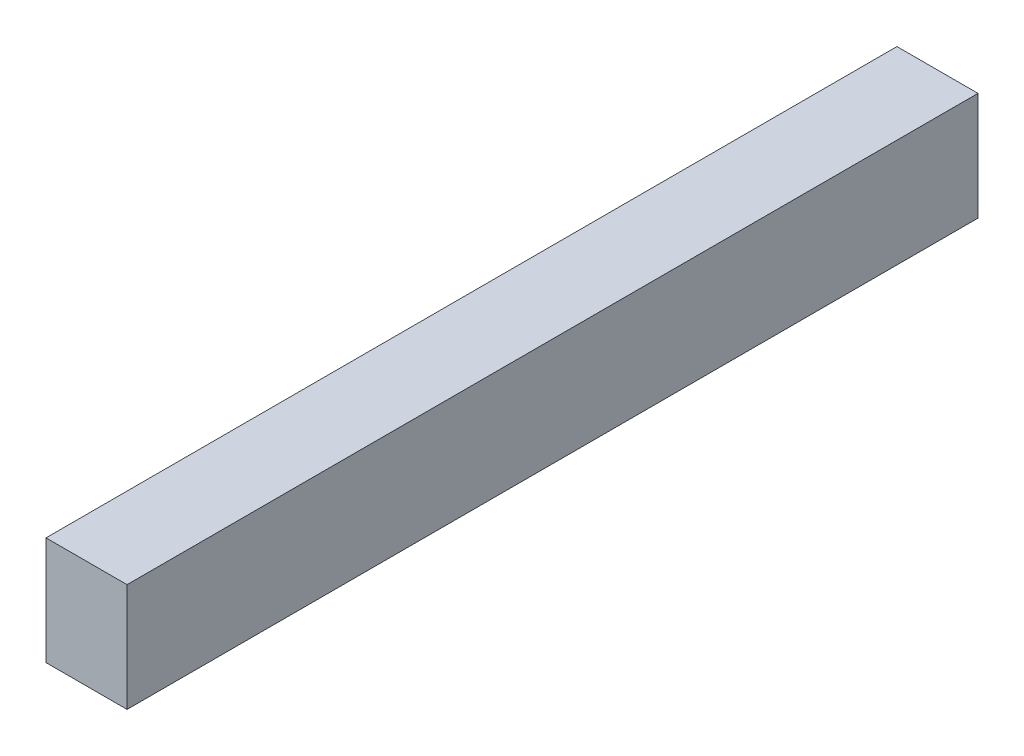
ISO-10303-21;
HEADER;
FILE_DESCRIPTION(('STEP AP214'),'2;1');
FILE_NAME('part.step','',(''),(''),'','','');
FILE_SCHEMA(('AUTOMOTIVE_DESIGN { 1 0 10303 214 1 1 1 1 }'));
ENDSEC;
DATA;
#1=APPLICATION_CONTEXT('core data for automotive mechanical design processes');
#2=APPLICATION_PROTOCOL_DEFINITION('international standard','automotive_design',2000,#1);
#3=PRODUCT_CONTEXT('',#1,'mechanical');
#4=PRODUCT('Part','Part','',(#3));
#5=PRODUCT_RELATED_PRODUCT_CATEGORY('part','',(#4));
#6=PRODUCT_DEFINITION_FORMATION('','',#4);
#7=PRODUCT_DEFINITION_CONTEXT('part definition',#1,'design');
#8=PRODUCT_DEFINITION('design','',#6,#7);
#9=PRODUCT_DEFINITION_SHAPE('','',#8);
#10=(LENGTH_UNIT() NAMED_UNIT(*) SI_UNIT(.MILLI.,.METRE.));
#11=(NAMED_UNIT(*) PLANE_ANGLE_UNIT() SI_UNIT($,.RADIAN.));
#12=(NAMED_UNIT(*) SI_UNIT($,.STERADIAN.) SOLID_ANGLE_UNIT());
#13=UNCERTAINTY_MEASURE_WITH_UNIT(LENGTH_MEASURE(1.E-05),#10,'distance_accuracy_value','');
#14=(GEOMETRIC_REPRESENTATION_CONTEXT(3) GLOBAL_UNCERTAINTY_ASSIGNED_CONTEXT((#13)) GLOBAL_UNIT_ASSIGNED_CONTEXT((#10,
#11,#12)) REPRESENTATION_CONTEXT('',''));
#15=CARTESIAN_POINT('',(0.,0.,0.));
#16=DIRECTION('',(0.,0.,1.));
#17=DIRECTION('',(1.,0.,0.));
#18=AXIS2_PLACEMENT_3D('',#15,#16,#17);
#19=CARTESIAN_POINT('',(-13.4796524663677,10.8968609865471,50.));
#20=DIRECTION('',(-1.,0.,0.));
#21=DIRECTION('',(0.,-1.,0.));
#22=AXIS2_PLACEMENT_3D('',#19,#20,#21);
#23=PLANE('',#22);
#24=DIRECTION('',(0.,1.,0.));
#25=VECTOR('',#24,1.);
#26=CARTESIAN_POINT('',(-13.4796524663677,10.8968609865471,0.));
#27=LINE('',#26,#25);
#28=CARTESIAN_POINT('',(-13.4796524663677,4.54686098654709,0.));
#29=VERTEX_POINT('',#28);
#30=CARTESIAN_POINT('',(-13.4796524663677,10.8968609865471,0.));
#31=VERTEX_POINT('',#30);
#32=EDGE_CURVE('E95',#29,#31,#27,.T.);
#33=ORIENTED_EDGE('',*,*,#32,.T.);
#34=DIRECTION('',(0.,0.,-1.));
#35=VECTOR('',#34,1.);
#36=CARTESIAN_POINT('',(-13.4796524663677,10.8968609865471,50.));
#37=LINE('',#36,#35);
#38=CARTESIAN_POINT('',(-13.4796524663677,10.8968609865471,50.));
#39=VERTEX_POINT('',#38);
#40=EDGE_CURVE('E11',#39,#31,#37,.T.);
#41=ORIENTED_EDGE('',*,*,#40,.F.);
#42=DIRECTION('',(0.,1.,0.));
#43=VECTOR('',#42,1.);
#44=CARTESIAN_POINT('',(-13.4796524663677,10.8968609865471,50.));
#45=LINE('',#44,#43);
#46=CARTESIAN_POINT('',(-13.4796524663677,4.54686098654709,50.));
#47=VERTEX_POINT('',#46);
#48=EDGE_CURVE('E83',#47,#39,#45,.T.);
#49=ORIENTED_EDGE('',*,*,#48,.F.);
#50=DIRECTION('',(0.,0.,-1.));
#51=VECTOR('',#50,1.);
#52=CARTESIAN_POINT('',(-13.4796524663677,4.54686098654709,50.));
#53=LINE('',#52,#51);
#54=EDGE_CURVE('E91',#47,#29,#53,.T.);
#55=ORIENTED_EDGE('',*,*,#54,.T.);
#56=EDGE_LOOP('',(#33,#41,#49,#55));
#57=FACE_BOUND('',#56,.T.);
#58=ADVANCED_FACE('F32',(#57),#23,.F.);
#59=CARTESIAN_POINT('',(-13.4796524663677,10.8968609865471,50.));
#60=DIRECTION('',(0.,-1.,0.));
#61=DIRECTION('',(1.,0.,0.));
#62=AXIS2_PLACEMENT_3D('',#59,#60,#61);
#63=PLANE('',#62);
#64=DIRECTION('',(-1.,0.,0.));
#65=VECTOR('',#64,1.);
#66=CARTESIAN_POINT('',(-13.4796524663677,10.8968609865471,0.));
#67=LINE('',#66,#65);
#68=CARTESIAN_POINT('',(-18.2421524663677,10.8968609865471,0.));
#69=VERTEX_POINT('',#68);
#70=EDGE_CURVE('E87',#31,#69,#67,.T.);
#71=ORIENTED_EDGE('',*,*,#70,.T.);
#72=DIRECTION('',(0.,0.,-1.));
#73=VECTOR('',#72,1.);
#74=CARTESIAN_POINT('',(-18.2421524663677,10.8968609865471,50.));
#75=LINE('',#74,#73);
#76=CARTESIAN_POINT('',(-18.2421524663677,10.8968609865471,50.));
#77=VERTEX_POINT('',#76);
#78=EDGE_CURVE('E40',#77,#69,#75,.T.);
#79=ORIENTED_EDGE('',*,*,#78,.F.);
#80=DIRECTION('',(-1.,0.,0.));
#81=VECTOR('',#80,1.);
#82=CARTESIAN_POINT('',(-13.4796524663677,10.8968609865471,50.));
#83=LINE('',#82,#81);
#84=EDGE_CURVE('E78',#39,#77,#83,.T.);
#85=ORIENTED_EDGE('',*,*,#84,.F.);
#86=ORIENTED_EDGE('',*,*,#40,.T.);
#87=EDGE_LOOP('',(#71,#79,#85,#86));
#88=FACE_BOUND('',#87,.T.);
#89=ADVANCED_FACE('F86',(#88),#63,.F.);
#90=CARTESIAN_POINT('',(-18.2421524663677,10.8968609865471,50.));
#91=DIRECTION('',(1.,0.,0.));
#92=DIRECTION('',(0.,1.,0.));
#93=AXIS2_PLACEMENT_3D('',#90,#91,#92);
#94=PLANE('',#93);
#95=DIRECTION('',(0.,-1.,0.));
#96=VECTOR('',#95,1.);
#97=CARTESIAN_POINT('',(-18.2421524663677,10.8968609865471,0.));
#98=LINE('',#97,#96);
#99=CARTESIAN_POINT('',(-18.2421524663677,4.54686098654709,0.));
#100=VERTEX_POINT('',#99);
#101=EDGE_CURVE('E65',#69,#100,#98,.T.);
#102=ORIENTED_EDGE('',*,*,#101,.T.);
#103=DIRECTION('',(0.,0.,-1.));
#104=VECTOR('',#103,1.);
#105=CARTESIAN_POINT('',(-18.2421524663677,4.54686098654709,50.));
#106=LINE('',#105,#104);
#107=CARTESIAN_POINT('',(-18.2421524663677,4.54686098654709,50.));
#108=VERTEX_POINT('',#107);
#109=EDGE_CURVE('E88',#108,#100,#106,.T.);
#110=ORIENTED_EDGE('',*,*,#109,.F.);
#111=DIRECTION('',(0.,-1.,0.));
#112=VECTOR('',#111,1.);
#113=CARTESIAN_POINT('',(-18.2421524663677,10.8968609865471,50.));
#114=LINE('',#113,#112);
#115=EDGE_CURVE('E81',#77,#108,#114,.T.);
#116=ORIENTED_EDGE('',*,*,#115,.F.);
#117=ORIENTED_EDGE('',*,*,#78,.T.);
#118=EDGE_LOOP('',(#102,#110,#116,#117));
#119=FACE_BOUND('',#118,.T.);
#120=ADVANCED_FACE('F89',(#119),#94,.F.);
#121=CARTESIAN_POINT('',(-13.4796524663677,4.54686098654709,50.));
#122=DIRECTION('',(0.,1.,0.));
#123=DIRECTION('',(-1.,0.,0.));
#124=AXIS2_PLACEMENT_3D('',#121,#122,#123);
#125=PLANE('',#124);
#126=DIRECTION('',(1.,0.,0.));
#127=VECTOR('',#126,1.);
#128=CARTESIAN_POINT('',(-13.4796524663677,4.54686098654709,0.));
#129=LINE('',#128,#127);
#130=EDGE_CURVE('E71',#100,#29,#129,.T.);
#131=ORIENTED_EDGE('',*,*,#130,.T.);
#132=ORIENTED_EDGE('',*,*,#54,.F.);
#133=DIRECTION('',(1.,0.,0.));
#134=VECTOR('',#133,1.);
#135=CARTESIAN_POINT('',(-13.4796524663677,4.54686098654709,50.));
#136=LINE('',#135,#134);
#137=EDGE_CURVE('E48',#108,#47,#136,.T.);
#138=ORIENTED_EDGE('',*,*,#137,.F.);
#139=ORIENTED_EDGE('',*,*,#109,.T.);
#140=EDGE_LOOP('',(#131,#132,#138,#139));
#141=FACE_BOUND('',#140,.T.);
#142=ADVANCED_FACE('F102',(#141),#125,.F.);
#143=CARTESIAN_POINT('',(0.,0.,50.));
#144=DIRECTION('',(0.,0.,-1.));
#145=DIRECTION('',(-1.,0.,0.));
#146=AXIS2_PLACEMENT_3D('',#143,#144,#145);
#147=PLANE('',#146);
#148=ORIENTED_EDGE('',*,*,#48,.T.);
#149=ORIENTED_EDGE('',*,*,#84,.T.);
#150=ORIENTED_EDGE('',*,*,#115,.T.);
#151=ORIENTED_EDGE('',*,*,#137,.T.);
#152=EDGE_LOOP('',(#148,#149,#150,#151));
#153=FACE_BOUND('',#152,.T.);
#154=ADVANCED_FACE('F79',(#153),#147,.F.);
#155=CARTESIAN_POINT('',(0.,0.,0.));
#156=DIRECTION('',(0.,0.,-1.));
#157=DIRECTION('',(-1.,0.,0.));
#158=AXIS2_PLACEMENT_3D('',#155,#156,#157);
#159=PLANE('',#158);
#160=ORIENTED_EDGE('',*,*,#32,.F.);
#161=ORIENTED_EDGE('',*,*,#130,.F.);
#162=ORIENTED_EDGE('',*,*,#101,.F.);
#163=ORIENTED_EDGE('',*,*,#70,.F.);
#164=EDGE_LOOP('',(#160,#161,#162,#163));
#165=FACE_BOUND('',#164,.T.);
#166=ADVANCED_FACE('F105',(#165),#159,.T.);
#167=CLOSED_SHELL('',(#58,#89,#120,#142,#154,#166));
#168=MANIFOLD_SOLID_BREP('B2',#167);
#169=ADVANCED_BREP_SHAPE_REPRESENTATION('',(#18,#168),#14);
#170=SHAPE_DEFINITION_REPRESENTATION(#9,#169);
ENDSEC;
END-ISO-10303-21;
